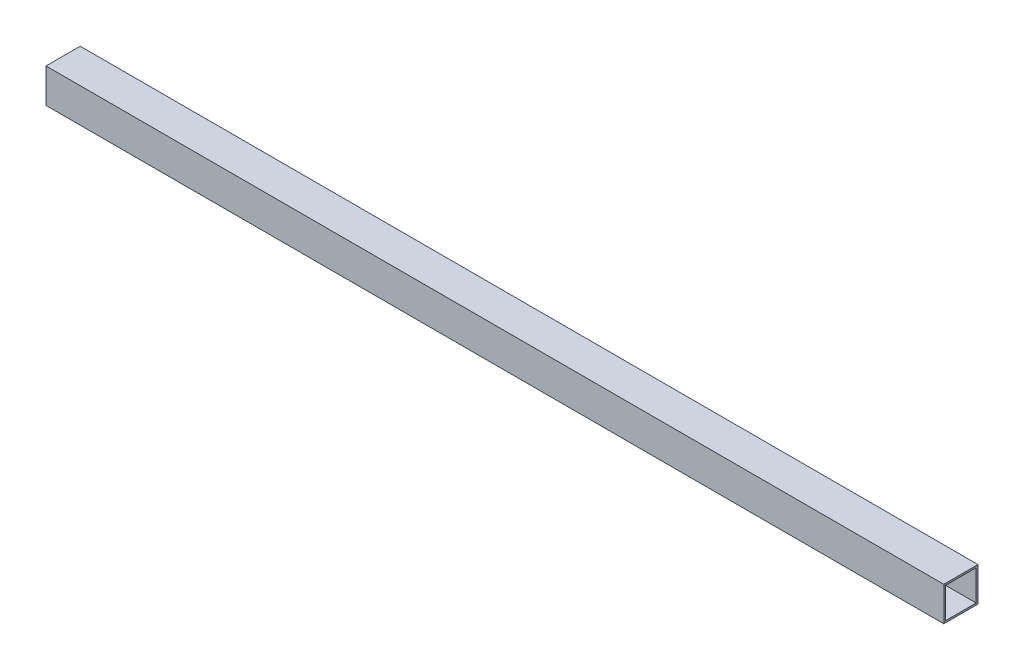
ISO-10303-21;
HEADER;
FILE_DESCRIPTION(('STEP AP214'),'2;1');
FILE_NAME('part.step','',(''),(''),'','','');
FILE_SCHEMA(('AUTOMOTIVE_DESIGN { 1 0 10303 214 1 1 1 1 }'));
ENDSEC;
DATA;
#1=APPLICATION_CONTEXT('core data for automotive mechanical design processes');
#2=APPLICATION_PROTOCOL_DEFINITION('international standard','automotive_design',2000,#1);
#3=PRODUCT_CONTEXT('',#1,'mechanical');
#4=PRODUCT('Part','Part','',(#3));
#5=PRODUCT_RELATED_PRODUCT_CATEGORY('part','',(#4));
#6=PRODUCT_DEFINITION_FORMATION('','',#4);
#7=PRODUCT_DEFINITION_CONTEXT('part definition',#1,'design');
#8=PRODUCT_DEFINITION('design','',#6,#7);
#9=PRODUCT_DEFINITION_SHAPE('','',#8);
#10=(LENGTH_UNIT() NAMED_UNIT(*) SI_UNIT(.MILLI.,.METRE.));
#11=(NAMED_UNIT(*) PLANE_ANGLE_UNIT() SI_UNIT($,.RADIAN.));
#12=(NAMED_UNIT(*) SI_UNIT($,.STERADIAN.) SOLID_ANGLE_UNIT());
#13=UNCERTAINTY_MEASURE_WITH_UNIT(LENGTH_MEASURE(1.E-05),#10,'distance_accuracy_value','');
#14=(GEOMETRIC_REPRESENTATION_CONTEXT(3) GLOBAL_UNCERTAINTY_ASSIGNED_CONTEXT((#13)) GLOBAL_UNIT_ASSIGNED_CONTEXT((#10,
#11,#12)) REPRESENTATION_CONTEXT('',''));
#15=CARTESIAN_POINT('',(0.,0.,0.));
#16=DIRECTION('',(0.,0.,1.));
#17=DIRECTION('',(1.,0.,0.));
#18=AXIS2_PLACEMENT_3D('',#15,#16,#17);
#19=CARTESIAN_POINT('',(500.,0.,0.));
#20=DIRECTION('',(1.,0.,0.));
#21=DIRECTION('',(0.,0.,-1.));
#22=AXIS2_PLACEMENT_3D('',#19,#20,#21);
#23=PLANE('',#22);
#24=DIRECTION('',(0.,1.,0.));
#25=VECTOR('',#24,1.);
#26=CARTESIAN_POINT('',(500.,9.525,-9.525));
#27=LINE('',#26,#25);
#28=CARTESIAN_POINT('',(500.,-9.525,-9.525));
#29=VERTEX_POINT('',#28);
#30=CARTESIAN_POINT('',(500.,9.525,-9.525));
#31=VERTEX_POINT('',#30);
#32=EDGE_CURVE('E133',#29,#31,#27,.T.);
#33=ORIENTED_EDGE('',*,*,#32,.T.);
#34=DIRECTION('',(0.,0.,1.));
#35=VECTOR('',#34,1.);
#36=CARTESIAN_POINT('',(500.,9.525,9.525));
#37=LINE('',#36,#35);
#38=CARTESIAN_POINT('',(500.,9.525,9.525));
#39=VERTEX_POINT('',#38);
#40=EDGE_CURVE('E136',#31,#39,#37,.T.);
#41=ORIENTED_EDGE('',*,*,#40,.T.);
#42=DIRECTION('',(0.,-1.,0.));
#43=VECTOR('',#42,1.);
#44=CARTESIAN_POINT('',(500.,9.525,9.525));
#45=LINE('',#44,#43);
#46=CARTESIAN_POINT('',(500.,-9.525,9.525));
#47=VERTEX_POINT('',#46);
#48=EDGE_CURVE('E139',#39,#47,#45,.T.);
#49=ORIENTED_EDGE('',*,*,#48,.T.);
#50=DIRECTION('',(0.,0.,-1.));
#51=VECTOR('',#50,1.);
#52=CARTESIAN_POINT('',(500.,-9.525,9.525));
#53=LINE('',#52,#51);
#54=EDGE_CURVE('E141',#47,#29,#53,.T.);
#55=ORIENTED_EDGE('',*,*,#54,.T.);
#56=EDGE_LOOP('',(#33,#41,#49,#55));
#57=FACE_BOUND('',#56,.T.);
#58=DIRECTION('',(0.,0.,-1.));
#59=VECTOR('',#58,1.);
#60=CARTESIAN_POINT('',(500.,-8.525,8.525));
#61=LINE('',#60,#59);
#62=CARTESIAN_POINT('',(500.,-8.525,8.525));
#63=VERTEX_POINT('',#62);
#64=CARTESIAN_POINT('',(500.,-8.525,-8.525));
#65=VERTEX_POINT('',#64);
#66=EDGE_CURVE('E105',#63,#65,#61,.T.);
#67=ORIENTED_EDGE('',*,*,#66,.F.);
#68=DIRECTION('',(0.,-1.,0.));
#69=VECTOR('',#68,1.);
#70=CARTESIAN_POINT('',(500.,8.525,8.525));
#71=LINE('',#70,#69);
#72=CARTESIAN_POINT('',(500.,8.525,8.525));
#73=VERTEX_POINT('',#72);
#74=EDGE_CURVE('E97',#73,#63,#71,.T.);
#75=ORIENTED_EDGE('',*,*,#74,.F.);
#76=DIRECTION('',(0.,0.,1.));
#77=VECTOR('',#76,1.);
#78=CARTESIAN_POINT('',(500.,8.525,8.525));
#79=LINE('',#78,#77);
#80=CARTESIAN_POINT('',(500.,8.525,-8.525));
#81=VERTEX_POINT('',#80);
#82=EDGE_CURVE('E119',#81,#73,#79,.T.);
#83=ORIENTED_EDGE('',*,*,#82,.F.);
#84=DIRECTION('',(0.,1.,0.));
#85=VECTOR('',#84,1.);
#86=CARTESIAN_POINT('',(500.,8.525,-8.525));
#87=LINE('',#86,#85);
#88=EDGE_CURVE('E117',#65,#81,#87,.T.);
#89=ORIENTED_EDGE('',*,*,#88,.F.);
#90=EDGE_LOOP('',(#67,#75,#83,#89));
#91=FACE_BOUND('',#90,.T.);
#92=ADVANCED_FACE('F32',(#57,#91),#23,.T.);
#93=CARTESIAN_POINT('',(0.,0.,0.));
#94=DIRECTION('',(1.,0.,0.));
#95=DIRECTION('',(0.,0.,-1.));
#96=AXIS2_PLACEMENT_3D('',#93,#94,#95);
#97=PLANE('',#96);
#98=DIRECTION('',(0.,1.,0.));
#99=VECTOR('',#98,1.);
#100=CARTESIAN_POINT('',(0.,9.525,-9.525));
#101=LINE('',#100,#99);
#102=CARTESIAN_POINT('',(0.,-9.525,-9.525));
#103=VERTEX_POINT('',#102);
#104=CARTESIAN_POINT('',(0.,9.525,-9.525));
#105=VERTEX_POINT('',#104);
#106=EDGE_CURVE('E113',#103,#105,#101,.T.);
#107=ORIENTED_EDGE('',*,*,#106,.F.);
#108=DIRECTION('',(0.,0.,-1.));
#109=VECTOR('',#108,1.);
#110=CARTESIAN_POINT('',(0.,-9.525,9.525));
#111=LINE('',#110,#109);
#112=CARTESIAN_POINT('',(0.,-9.525,9.525));
#113=VERTEX_POINT('',#112);
#114=EDGE_CURVE('E137',#113,#103,#111,.T.);
#115=ORIENTED_EDGE('',*,*,#114,.F.);
#116=DIRECTION('',(0.,-1.,0.));
#117=VECTOR('',#116,1.);
#118=CARTESIAN_POINT('',(0.,9.525,9.525));
#119=LINE('',#118,#117);
#120=CARTESIAN_POINT('',(0.,9.525,9.525));
#121=VERTEX_POINT('',#120);
#122=EDGE_CURVE('E148',#121,#113,#119,.T.);
#123=ORIENTED_EDGE('',*,*,#122,.F.);
#124=DIRECTION('',(0.,0.,1.));
#125=VECTOR('',#124,1.);
#126=CARTESIAN_POINT('',(0.,9.525,9.525));
#127=LINE('',#126,#125);
#128=EDGE_CURVE('E146',#105,#121,#127,.T.);
#129=ORIENTED_EDGE('',*,*,#128,.F.);
#130=EDGE_LOOP('',(#107,#115,#123,#129));
#131=FACE_BOUND('',#130,.T.);
#132=DIRECTION('',(0.,-1.,0.));
#133=VECTOR('',#132,1.);
#134=CARTESIAN_POINT('',(0.,8.525,8.525));
#135=LINE('',#134,#133);
#136=CARTESIAN_POINT('',(0.,8.525,8.525));
#137=VERTEX_POINT('',#136);
#138=CARTESIAN_POINT('',(0.,-8.525,8.525));
#139=VERTEX_POINT('',#138);
#140=EDGE_CURVE('E55',#137,#139,#135,.T.);
#141=ORIENTED_EDGE('',*,*,#140,.T.);
#142=DIRECTION('',(0.,0.,-1.));
#143=VECTOR('',#142,1.);
#144=CARTESIAN_POINT('',(0.,-8.525,8.525));
#145=LINE('',#144,#143);
#146=CARTESIAN_POINT('',(0.,-8.525,-8.525));
#147=VERTEX_POINT('',#146);
#148=EDGE_CURVE('E112',#139,#147,#145,.T.);
#149=ORIENTED_EDGE('',*,*,#148,.T.);
#150=DIRECTION('',(0.,1.,0.));
#151=VECTOR('',#150,1.);
#152=CARTESIAN_POINT('',(0.,8.525,-8.525));
#153=LINE('',#152,#151);
#154=CARTESIAN_POINT('',(0.,8.525,-8.525));
#155=VERTEX_POINT('',#154);
#156=EDGE_CURVE('E125',#147,#155,#153,.T.);
#157=ORIENTED_EDGE('',*,*,#156,.T.);
#158=DIRECTION('',(0.,0.,1.));
#159=VECTOR('',#158,1.);
#160=CARTESIAN_POINT('',(0.,8.525,8.525));
#161=LINE('',#160,#159);
#162=EDGE_CURVE('E106',#155,#137,#161,.T.);
#163=ORIENTED_EDGE('',*,*,#162,.T.);
#164=EDGE_LOOP('',(#141,#149,#157,#163));
#165=FACE_BOUND('',#164,.T.);
#166=ADVANCED_FACE('F166',(#131,#165),#97,.F.);
#167=CARTESIAN_POINT('',(500.,9.525,-9.525));
#168=DIRECTION('',(0.,0.,1.));
#169=DIRECTION('',(0.,-1.,0.));
#170=AXIS2_PLACEMENT_3D('',#167,#168,#169);
#171=PLANE('',#170);
#172=ORIENTED_EDGE('',*,*,#106,.T.);
#173=DIRECTION('',(-1.,0.,0.));
#174=VECTOR('',#173,1.);
#175=CARTESIAN_POINT('',(500.,9.525,-9.525));
#176=LINE('',#175,#174);
#177=EDGE_CURVE('E11',#31,#105,#176,.T.);
#178=ORIENTED_EDGE('',*,*,#177,.F.);
#179=ORIENTED_EDGE('',*,*,#32,.F.);
#180=DIRECTION('',(-1.,0.,0.));
#181=VECTOR('',#180,1.);
#182=CARTESIAN_POINT('',(500.,-9.525,-9.525));
#183=LINE('',#182,#181);
#184=EDGE_CURVE('E143',#29,#103,#183,.T.);
#185=ORIENTED_EDGE('',*,*,#184,.T.);
#186=EDGE_LOOP('',(#172,#178,#179,#185));
#187=FACE_BOUND('',#186,.T.);
#188=ADVANCED_FACE('F34',(#187),#171,.F.);
#189=CARTESIAN_POINT('',(500.,9.525,9.525));
#190=DIRECTION('',(0.,-1.,0.));
#191=DIRECTION('',(0.,0.,-1.));
#192=AXIS2_PLACEMENT_3D('',#189,#190,#191);
#193=PLANE('',#192);
#194=ORIENTED_EDGE('',*,*,#128,.T.);
#195=DIRECTION('',(-1.,0.,0.));
#196=VECTOR('',#195,1.);
#197=CARTESIAN_POINT('',(500.,9.525,9.525));
#198=LINE('',#197,#196);
#199=EDGE_CURVE('E40',#39,#121,#198,.T.);
#200=ORIENTED_EDGE('',*,*,#199,.F.);
#201=ORIENTED_EDGE('',*,*,#40,.F.);
#202=ORIENTED_EDGE('',*,*,#177,.T.);
#203=EDGE_LOOP('',(#194,#200,#201,#202));
#204=FACE_BOUND('',#203,.T.);
#205=ADVANCED_FACE('F176',(#204),#193,.F.);
#206=CARTESIAN_POINT('',(500.,9.525,9.525));
#207=DIRECTION('',(0.,0.,-1.));
#208=DIRECTION('',(0.,1.,0.));
#209=AXIS2_PLACEMENT_3D('',#206,#207,#208);
#210=PLANE('',#209);
#211=ORIENTED_EDGE('',*,*,#122,.T.);
#212=DIRECTION('',(-1.,0.,0.));
#213=VECTOR('',#212,1.);
#214=CARTESIAN_POINT('',(500.,-9.525,9.525));
#215=LINE('',#214,#213);
#216=EDGE_CURVE('E153',#47,#113,#215,.T.);
#217=ORIENTED_EDGE('',*,*,#216,.F.);
#218=ORIENTED_EDGE('',*,*,#48,.F.);
#219=ORIENTED_EDGE('',*,*,#199,.T.);
#220=EDGE_LOOP('',(#211,#217,#218,#219));
#221=FACE_BOUND('',#220,.T.);
#222=ADVANCED_FACE('F160',(#221),#210,.F.);
#223=CARTESIAN_POINT('',(500.,-9.525,9.525));
#224=DIRECTION('',(0.,1.,0.));
#225=DIRECTION('',(0.,0.,1.));
#226=AXIS2_PLACEMENT_3D('',#223,#224,#225);
#227=PLANE('',#226);
#228=ORIENTED_EDGE('',*,*,#114,.T.);
#229=ORIENTED_EDGE('',*,*,#184,.F.);
#230=ORIENTED_EDGE('',*,*,#54,.F.);
#231=ORIENTED_EDGE('',*,*,#216,.T.);
#232=EDGE_LOOP('',(#228,#229,#230,#231));
#233=FACE_BOUND('',#232,.T.);
#234=ADVANCED_FACE('F170',(#233),#227,.F.);
#235=CARTESIAN_POINT('',(500.,8.525,8.525));
#236=DIRECTION('',(0.,0.,-1.));
#237=DIRECTION('',(-1.,0.,0.));
#238=AXIS2_PLACEMENT_3D('',#235,#236,#237);
#239=PLANE('',#238);
#240=ORIENTED_EDGE('',*,*,#140,.F.);
#241=DIRECTION('',(-1.,0.,0.));
#242=VECTOR('',#241,1.);
#243=CARTESIAN_POINT('',(500.,8.525,8.525));
#244=LINE('',#243,#242);
#245=EDGE_CURVE('E101',#73,#137,#244,.T.);
#246=ORIENTED_EDGE('',*,*,#245,.F.);
#247=ORIENTED_EDGE('',*,*,#74,.T.);
#248=DIRECTION('',(-1.,0.,0.));
#249=VECTOR('',#248,1.);
#250=CARTESIAN_POINT('',(500.,-8.525,8.525));
#251=LINE('',#250,#249);
#252=EDGE_CURVE('E100',#63,#139,#251,.T.);
#253=ORIENTED_EDGE('',*,*,#252,.T.);
#254=EDGE_LOOP('',(#240,#246,#247,#253));
#255=FACE_BOUND('',#254,.T.);
#256=ADVANCED_FACE('F99',(#255),#239,.T.);
#257=CARTESIAN_POINT('',(500.,-8.525,8.525));
#258=DIRECTION('',(0.,1.,0.));
#259=DIRECTION('',(0.,0.,1.));
#260=AXIS2_PLACEMENT_3D('',#257,#258,#259);
#261=PLANE('',#260);
#262=ORIENTED_EDGE('',*,*,#148,.F.);
#263=ORIENTED_EDGE('',*,*,#252,.F.);
#264=ORIENTED_EDGE('',*,*,#66,.T.);
#265=DIRECTION('',(-1.,0.,0.));
#266=VECTOR('',#265,1.);
#267=CARTESIAN_POINT('',(500.,-8.525,-8.525));
#268=LINE('',#267,#266);
#269=EDGE_CURVE('E114',#65,#147,#268,.T.);
#270=ORIENTED_EDGE('',*,*,#269,.T.);
#271=EDGE_LOOP('',(#262,#263,#264,#270));
#272=FACE_BOUND('',#271,.T.);
#273=ADVANCED_FACE('F109',(#272),#261,.T.);
#274=CARTESIAN_POINT('',(500.,8.525,-8.525));
#275=DIRECTION('',(0.,0.,1.));
#276=DIRECTION('',(0.,-1.,0.));
#277=AXIS2_PLACEMENT_3D('',#274,#275,#276);
#278=PLANE('',#277);
#279=ORIENTED_EDGE('',*,*,#156,.F.);
#280=ORIENTED_EDGE('',*,*,#269,.F.);
#281=ORIENTED_EDGE('',*,*,#88,.T.);
#282=DIRECTION('',(-1.,0.,0.));
#283=VECTOR('',#282,1.);
#284=CARTESIAN_POINT('',(500.,8.525,-8.525));
#285=LINE('',#284,#283);
#286=EDGE_CURVE('E47',#81,#155,#285,.T.);
#287=ORIENTED_EDGE('',*,*,#286,.T.);
#288=EDGE_LOOP('',(#279,#280,#281,#287));
#289=FACE_BOUND('',#288,.T.);
#290=ADVANCED_FACE('F199',(#289),#278,.T.);
#291=CARTESIAN_POINT('',(500.,8.525,8.525));
#292=DIRECTION('',(0.,-1.,0.));
#293=DIRECTION('',(0.,0.,-1.));
#294=AXIS2_PLACEMENT_3D('',#291,#292,#293);
#295=PLANE('',#294);
#296=ORIENTED_EDGE('',*,*,#162,.F.);
#297=ORIENTED_EDGE('',*,*,#286,.F.);
#298=ORIENTED_EDGE('',*,*,#82,.T.);
#299=ORIENTED_EDGE('',*,*,#245,.T.);
#300=EDGE_LOOP('',(#296,#297,#298,#299));
#301=FACE_BOUND('',#300,.T.);
#302=ADVANCED_FACE('F203',(#301),#295,.T.);
#303=CLOSED_SHELL('',(#92,#166,#188,#205,#222,#234,#256,#273,#290,#302));
#304=MANIFOLD_SOLID_BREP('B2',#303);
#305=ADVANCED_BREP_SHAPE_REPRESENTATION('',(#18,#304),#14);
#306=SHAPE_DEFINITION_REPRESENTATION(#9,#305);
ENDSEC;
END-ISO-10303-21;
